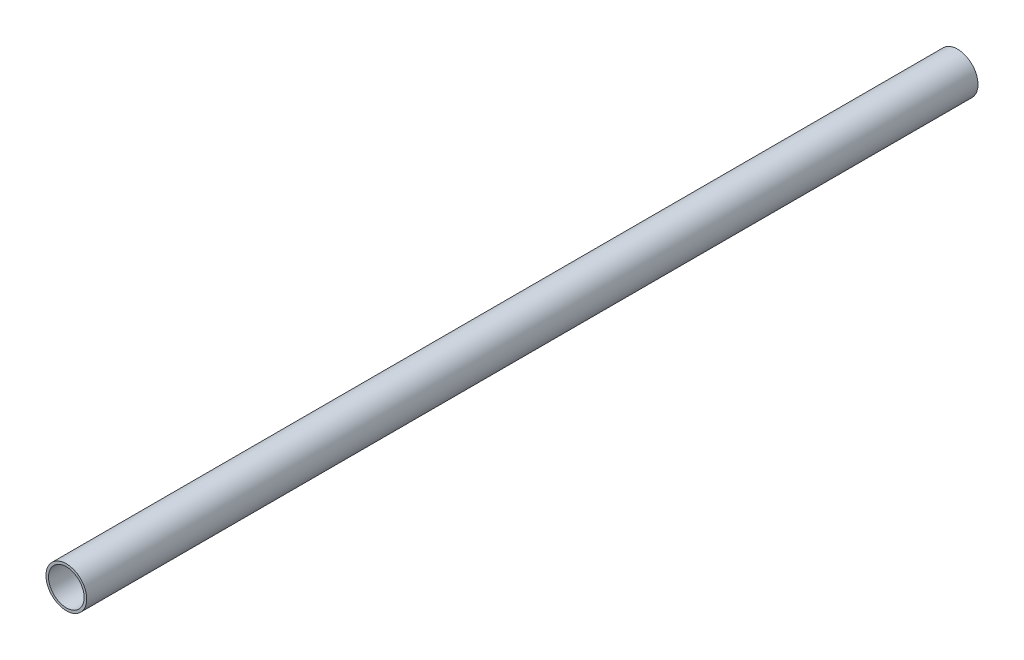
ISO-10303-21;
HEADER;
FILE_DESCRIPTION(('STEP AP214'),'2;1');
FILE_NAME('part.step','',(''),(''),'','','');
FILE_SCHEMA(('AUTOMOTIVE_DESIGN { 1 0 10303 214 1 1 1 1 }'));
ENDSEC;
DATA;
#1=APPLICATION_CONTEXT('core data for automotive mechanical design processes');
#2=APPLICATION_PROTOCOL_DEFINITION('international standard','automotive_design',2000,#1);
#3=PRODUCT_CONTEXT('',#1,'mechanical');
#4=PRODUCT('Part','Part','',(#3));
#5=PRODUCT_RELATED_PRODUCT_CATEGORY('part','',(#4));
#6=PRODUCT_DEFINITION_FORMATION('','',#4);
#7=PRODUCT_DEFINITION_CONTEXT('part definition',#1,'design');
#8=PRODUCT_DEFINITION('design','',#6,#7);
#9=PRODUCT_DEFINITION_SHAPE('','',#8);
#10=(LENGTH_UNIT() NAMED_UNIT(*) SI_UNIT(.MILLI.,.METRE.));
#11=(NAMED_UNIT(*) PLANE_ANGLE_UNIT() SI_UNIT($,.RADIAN.));
#12=(NAMED_UNIT(*) SI_UNIT($,.STERADIAN.) SOLID_ANGLE_UNIT());
#13=UNCERTAINTY_MEASURE_WITH_UNIT(LENGTH_MEASURE(1.E-05),#10,'distance_accuracy_value','');
#14=(GEOMETRIC_REPRESENTATION_CONTEXT(3) GLOBAL_UNCERTAINTY_ASSIGNED_CONTEXT((#13)) GLOBAL_UNIT_ASSIGNED_CONTEXT((#10,
#11,#12)) REPRESENTATION_CONTEXT('',''));
#15=CARTESIAN_POINT('',(0.,0.,0.));
#16=DIRECTION('',(0.,0.,1.));
#17=DIRECTION('',(1.,0.,0.));
#18=AXIS2_PLACEMENT_3D('',#15,#16,#17);
#19=CARTESIAN_POINT('',(0.,0.,700.));
#20=DIRECTION('',(0.,0.,1.));
#21=DIRECTION('',(1.,0.,0.));
#22=AXIS2_PLACEMENT_3D('',#19,#20,#21);
#23=PLANE('',#22);
#24=CARTESIAN_POINT('',(0.,0.,700.));
#25=DIRECTION('',(0.,0.,1.));
#26=DIRECTION('',(1.,0.,0.));
#27=AXIS2_PLACEMENT_3D('',#24,#25,#26);
#28=CIRCLE('',#27,16.);
#29=CARTESIAN_POINT('',(16.,0.,700.));
#30=VERTEX_POINT('',#29);
#31=EDGE_CURVE('E10',#30,#30,#28,.T.);
#32=ORIENTED_EDGE('',*,*,#31,.T.);
#33=EDGE_LOOP('',(#32));
#34=FACE_BOUND('',#33,.T.);
#35=CARTESIAN_POINT('',(0.,0.,700.));
#36=DIRECTION('',(0.,0.,1.));
#37=DIRECTION('',(1.,0.,0.));
#38=AXIS2_PLACEMENT_3D('',#35,#36,#37);
#39=CIRCLE('',#38,14.);
#40=CARTESIAN_POINT('',(14.,0.,700.));
#41=VERTEX_POINT('',#40);
#42=EDGE_CURVE('E41',#41,#41,#39,.T.);
#43=ORIENTED_EDGE('',*,*,#42,.F.);
#44=EDGE_LOOP('',(#43));
#45=FACE_BOUND('',#44,.T.);
#46=ADVANCED_FACE('F30',(#34,#45),#23,.T.);
#47=CARTESIAN_POINT('',(0.,0.,0.));
#48=DIRECTION('',(0.,0.,1.));
#49=DIRECTION('',(1.,0.,0.));
#50=AXIS2_PLACEMENT_3D('',#47,#48,#49);
#51=PLANE('',#50);
#52=CARTESIAN_POINT('',(0.,0.,0.));
#53=DIRECTION('',(0.,0.,1.));
#54=DIRECTION('',(1.,0.,0.));
#55=AXIS2_PLACEMENT_3D('',#52,#53,#54);
#56=CIRCLE('',#55,16.);
#57=CARTESIAN_POINT('',(16.,0.,0.));
#58=VERTEX_POINT('',#57);
#59=EDGE_CURVE('E34',#58,#58,#56,.T.);
#60=ORIENTED_EDGE('',*,*,#59,.F.);
#61=EDGE_LOOP('',(#60));
#62=FACE_BOUND('',#61,.T.);
#63=CARTESIAN_POINT('',(0.,0.,0.));
#64=DIRECTION('',(0.,0.,1.));
#65=DIRECTION('',(1.,0.,0.));
#66=AXIS2_PLACEMENT_3D('',#63,#64,#65);
#67=CIRCLE('',#66,14.);
#68=CARTESIAN_POINT('',(14.,0.,0.));
#69=VERTEX_POINT('',#68);
#70=EDGE_CURVE('E43',#69,#69,#67,.T.);
#71=ORIENTED_EDGE('',*,*,#70,.T.);
#72=EDGE_LOOP('',(#71));
#73=FACE_BOUND('',#72,.T.);
#74=ADVANCED_FACE('F53',(#62,#73),#51,.F.);
#75=CARTESIAN_POINT('',(0.,0.,700.));
#76=DIRECTION('',(0.,0.,-1.));
#77=DIRECTION('',(-1.,0.,0.));
#78=AXIS2_PLACEMENT_3D('',#75,#76,#77);
#79=CYLINDRICAL_SURFACE('',#78,16.);
#80=ORIENTED_EDGE('',*,*,#31,.F.);
#81=EDGE_LOOP('',(#80));
#82=FACE_BOUND('',#81,.T.);
#83=ORIENTED_EDGE('',*,*,#59,.T.);
#84=EDGE_LOOP('',(#83));
#85=FACE_BOUND('',#84,.T.);
#86=ADVANCED_FACE('F32',(#82,#85),#79,.T.);
#87=CARTESIAN_POINT('',(0.,0.,700.));
#88=DIRECTION('',(0.,0.,-1.));
#89=DIRECTION('',(-1.,0.,0.));
#90=AXIS2_PLACEMENT_3D('',#87,#88,#89);
#91=CYLINDRICAL_SURFACE('',#90,14.);
#92=ORIENTED_EDGE('',*,*,#42,.T.);
#93=EDGE_LOOP('',(#92));
#94=FACE_BOUND('',#93,.T.);
#95=ORIENTED_EDGE('',*,*,#70,.F.);
#96=EDGE_LOOP('',(#95));
#97=FACE_BOUND('',#96,.T.);
#98=ADVANCED_FACE('F49',(#94,#97),#91,.F.);
#99=CLOSED_SHELL('',(#46,#74,#86,#98));
#100=MANIFOLD_SOLID_BREP('B2',#99);
#101=ADVANCED_BREP_SHAPE_REPRESENTATION('',(#18,#100),#14);
#102=SHAPE_DEFINITION_REPRESENTATION(#9,#101);
ENDSEC;
END-ISO-10303-21;
